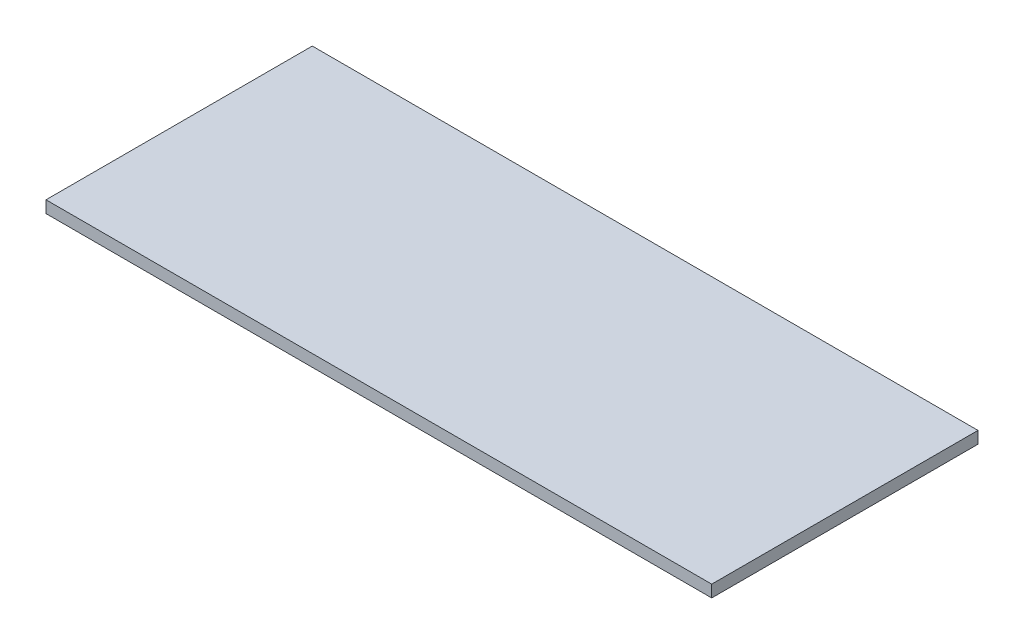
ISO-10303-21;
HEADER;
FILE_DESCRIPTION(('STEP AP214'),'2;1');
FILE_NAME('part.step','',(''),(''),'','','');
FILE_SCHEMA(('AUTOMOTIVE_DESIGN { 1 0 10303 214 1 1 1 1 }'));
ENDSEC;
DATA;
#1=APPLICATION_CONTEXT('core data for automotive mechanical design processes');
#2=APPLICATION_PROTOCOL_DEFINITION('international standard','automotive_design',2000,#1);
#3=PRODUCT_CONTEXT('',#1,'mechanical');
#4=PRODUCT('Part','Part','',(#3));
#5=PRODUCT_RELATED_PRODUCT_CATEGORY('part','',(#4));
#6=PRODUCT_DEFINITION_FORMATION('','',#4);
#7=PRODUCT_DEFINITION_CONTEXT('part definition',#1,'design');
#8=PRODUCT_DEFINITION('design','',#6,#7);
#9=PRODUCT_DEFINITION_SHAPE('','',#8);
#10=(LENGTH_UNIT() NAMED_UNIT(*) SI_UNIT(.MILLI.,.METRE.));
#11=(NAMED_UNIT(*) PLANE_ANGLE_UNIT() SI_UNIT($,.RADIAN.));
#12=(NAMED_UNIT(*) SI_UNIT($,.STERADIAN.) SOLID_ANGLE_UNIT());
#13=UNCERTAINTY_MEASURE_WITH_UNIT(LENGTH_MEASURE(1.E-05),#10,'distance_accuracy_value','');
#14=(GEOMETRIC_REPRESENTATION_CONTEXT(3) GLOBAL_UNCERTAINTY_ASSIGNED_CONTEXT((#13)) GLOBAL_UNIT_ASSIGNED_CONTEXT((#10,
#11,#12)) REPRESENTATION_CONTEXT('',''));
#15=CARTESIAN_POINT('',(0.,0.,0.));
#16=DIRECTION('',(0.,0.,1.));
#17=DIRECTION('',(1.,0.,0.));
#18=AXIS2_PLACEMENT_3D('',#15,#16,#17);
#19=CARTESIAN_POINT('',(500.,18.,-200.));
#20=DIRECTION('',(-1.,0.,0.));
#21=DIRECTION('',(0.,0.,1.));
#22=AXIS2_PLACEMENT_3D('',#19,#20,#21);
#23=PLANE('',#22);
#24=DIRECTION('',(0.,0.,-1.));
#25=VECTOR('',#24,1.);
#26=CARTESIAN_POINT('',(500.,0.,-200.));
#27=LINE('',#26,#25);
#28=CARTESIAN_POINT('',(500.,0.,200.));
#29=VERTEX_POINT('',#28);
#30=CARTESIAN_POINT('',(500.,0.,-200.));
#31=VERTEX_POINT('',#30);
#32=EDGE_CURVE('E96',#29,#31,#27,.T.);
#33=ORIENTED_EDGE('',*,*,#32,.T.);
#34=DIRECTION('',(0.,-1.,0.));
#35=VECTOR('',#34,1.);
#36=CARTESIAN_POINT('',(500.,18.,-200.));
#37=LINE('',#36,#35);
#38=CARTESIAN_POINT('',(500.,18.,-200.));
#39=VERTEX_POINT('',#38);
#40=EDGE_CURVE('E11',#39,#31,#37,.T.);
#41=ORIENTED_EDGE('',*,*,#40,.F.);
#42=DIRECTION('',(0.,0.,-1.));
#43=VECTOR('',#42,1.);
#44=CARTESIAN_POINT('',(500.,18.,-200.));
#45=LINE('',#44,#43);
#46=CARTESIAN_POINT('',(500.,18.,200.));
#47=VERTEX_POINT('',#46);
#48=EDGE_CURVE('E84',#47,#39,#45,.T.);
#49=ORIENTED_EDGE('',*,*,#48,.F.);
#50=DIRECTION('',(0.,-1.,0.));
#51=VECTOR('',#50,1.);
#52=CARTESIAN_POINT('',(500.,18.,200.));
#53=LINE('',#52,#51);
#54=EDGE_CURVE('E92',#47,#29,#53,.T.);
#55=ORIENTED_EDGE('',*,*,#54,.T.);
#56=EDGE_LOOP('',(#33,#41,#49,#55));
#57=FACE_BOUND('',#56,.T.);
#58=ADVANCED_FACE('F33',(#57),#23,.F.);
#59=CARTESIAN_POINT('',(-500.,18.,-200.));
#60=DIRECTION('',(0.,0.,1.));
#61=DIRECTION('',(1.,0.,0.));
#62=AXIS2_PLACEMENT_3D('',#59,#60,#61);
#63=PLANE('',#62);
#64=DIRECTION('',(-1.,0.,0.));
#65=VECTOR('',#64,1.);
#66=CARTESIAN_POINT('',(-500.,0.,-200.));
#67=LINE('',#66,#65);
#68=CARTESIAN_POINT('',(-500.,0.,-200.));
#69=VERTEX_POINT('',#68);
#70=EDGE_CURVE('E88',#31,#69,#67,.T.);
#71=ORIENTED_EDGE('',*,*,#70,.T.);
#72=DIRECTION('',(0.,-1.,0.));
#73=VECTOR('',#72,1.);
#74=CARTESIAN_POINT('',(-500.,18.,-200.));
#75=LINE('',#74,#73);
#76=CARTESIAN_POINT('',(-500.,18.,-200.));
#77=VERTEX_POINT('',#76);
#78=EDGE_CURVE('E41',#77,#69,#75,.T.);
#79=ORIENTED_EDGE('',*,*,#78,.F.);
#80=DIRECTION('',(-1.,0.,0.));
#81=VECTOR('',#80,1.);
#82=CARTESIAN_POINT('',(-500.,18.,-200.));
#83=LINE('',#82,#81);
#84=EDGE_CURVE('E79',#39,#77,#83,.T.);
#85=ORIENTED_EDGE('',*,*,#84,.F.);
#86=ORIENTED_EDGE('',*,*,#40,.T.);
#87=EDGE_LOOP('',(#71,#79,#85,#86));
#88=FACE_BOUND('',#87,.T.);
#89=ADVANCED_FACE('F87',(#88),#63,.F.);
#90=CARTESIAN_POINT('',(-500.,18.,-200.));
#91=DIRECTION('',(1.,0.,0.));
#92=DIRECTION('',(0.,0.,-1.));
#93=AXIS2_PLACEMENT_3D('',#90,#91,#92);
#94=PLANE('',#93);
#95=DIRECTION('',(0.,0.,1.));
#96=VECTOR('',#95,1.);
#97=CARTESIAN_POINT('',(-500.,0.,-200.));
#98=LINE('',#97,#96);
#99=CARTESIAN_POINT('',(-500.,0.,200.));
#100=VERTEX_POINT('',#99);
#101=EDGE_CURVE('E66',#69,#100,#98,.T.);
#102=ORIENTED_EDGE('',*,*,#101,.T.);
#103=DIRECTION('',(0.,-1.,0.));
#104=VECTOR('',#103,1.);
#105=CARTESIAN_POINT('',(-500.,18.,200.));
#106=LINE('',#105,#104);
#107=CARTESIAN_POINT('',(-500.,18.,200.));
#108=VERTEX_POINT('',#107);
#109=EDGE_CURVE('E89',#108,#100,#106,.T.);
#110=ORIENTED_EDGE('',*,*,#109,.F.);
#111=DIRECTION('',(0.,0.,1.));
#112=VECTOR('',#111,1.);
#113=CARTESIAN_POINT('',(-500.,18.,-200.));
#114=LINE('',#113,#112);
#115=EDGE_CURVE('E82',#77,#108,#114,.T.);
#116=ORIENTED_EDGE('',*,*,#115,.F.);
#117=ORIENTED_EDGE('',*,*,#78,.T.);
#118=EDGE_LOOP('',(#102,#110,#116,#117));
#119=FACE_BOUND('',#118,.T.);
#120=ADVANCED_FACE('F90',(#119),#94,.F.);
#121=CARTESIAN_POINT('',(-500.,18.,200.));
#122=DIRECTION('',(0.,0.,-1.));
#123=DIRECTION('',(-1.,0.,0.));
#124=AXIS2_PLACEMENT_3D('',#121,#122,#123);
#125=PLANE('',#124);
#126=DIRECTION('',(1.,0.,0.));
#127=VECTOR('',#126,1.);
#128=CARTESIAN_POINT('',(-500.,0.,200.));
#129=LINE('',#128,#127);
#130=EDGE_CURVE('E72',#100,#29,#129,.T.);
#131=ORIENTED_EDGE('',*,*,#130,.T.);
#132=ORIENTED_EDGE('',*,*,#54,.F.);
#133=DIRECTION('',(1.,0.,0.));
#134=VECTOR('',#133,1.);
#135=CARTESIAN_POINT('',(-500.,18.,200.));
#136=LINE('',#135,#134);
#137=EDGE_CURVE('E49',#108,#47,#136,.T.);
#138=ORIENTED_EDGE('',*,*,#137,.F.);
#139=ORIENTED_EDGE('',*,*,#109,.T.);
#140=EDGE_LOOP('',(#131,#132,#138,#139));
#141=FACE_BOUND('',#140,.T.);
#142=ADVANCED_FACE('F103',(#141),#125,.F.);
#143=CARTESIAN_POINT('',(0.,18.,0.));
#144=DIRECTION('',(0.,1.,0.));
#145=DIRECTION('',(0.,0.,1.));
#146=AXIS2_PLACEMENT_3D('',#143,#144,#145);
#147=PLANE('',#146);
#148=ORIENTED_EDGE('',*,*,#48,.T.);
#149=ORIENTED_EDGE('',*,*,#84,.T.);
#150=ORIENTED_EDGE('',*,*,#115,.T.);
#151=ORIENTED_EDGE('',*,*,#137,.T.);
#152=EDGE_LOOP('',(#148,#149,#150,#151));
#153=FACE_BOUND('',#152,.T.);
#154=ADVANCED_FACE('F80',(#153),#147,.T.);
#155=CARTESIAN_POINT('',(0.,0.,0.));
#156=DIRECTION('',(0.,1.,0.));
#157=DIRECTION('',(0.,0.,1.));
#158=AXIS2_PLACEMENT_3D('',#155,#156,#157);
#159=PLANE('',#158);
#160=ORIENTED_EDGE('',*,*,#32,.F.);
#161=ORIENTED_EDGE('',*,*,#130,.F.);
#162=ORIENTED_EDGE('',*,*,#101,.F.);
#163=ORIENTED_EDGE('',*,*,#70,.F.);
#164=EDGE_LOOP('',(#160,#161,#162,#163));
#165=FACE_BOUND('',#164,.T.);
#166=ADVANCED_FACE('F106',(#165),#159,.F.);
#167=CLOSED_SHELL('',(#58,#89,#120,#142,#154,#166));
#168=MANIFOLD_SOLID_BREP('B2',#167);
#169=ADVANCED_BREP_SHAPE_REPRESENTATION('',(#18,#168),#14);
#170=SHAPE_DEFINITION_REPRESENTATION(#9,#169);
ENDSEC;
END-ISO-10303-21;
